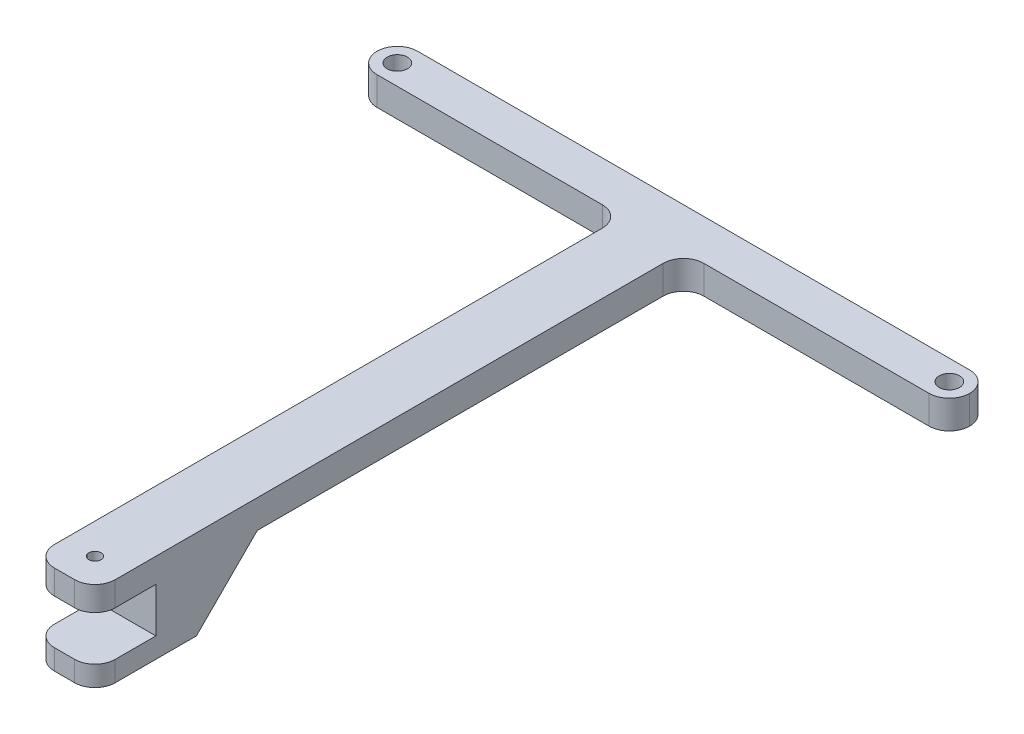
ISO-10303-21;
HEADER;
FILE_DESCRIPTION(('STEP AP214'),'2;1');
FILE_NAME('part.step','',(''),(''),'','','');
FILE_SCHEMA(('AUTOMOTIVE_DESIGN { 1 0 10303 214 1 1 1 1 }'));
ENDSEC;
DATA;
#1=APPLICATION_CONTEXT('core data for automotive mechanical design processes');
#2=APPLICATION_PROTOCOL_DEFINITION('international standard','automotive_design',2000,#1);
#3=PRODUCT_CONTEXT('',#1,'mechanical');
#4=PRODUCT('Part','Part','',(#3));
#5=PRODUCT_RELATED_PRODUCT_CATEGORY('part','',(#4));
#6=PRODUCT_DEFINITION_FORMATION('','',#4);
#7=PRODUCT_DEFINITION_CONTEXT('part definition',#1,'design');
#8=PRODUCT_DEFINITION('design','',#6,#7);
#9=PRODUCT_DEFINITION_SHAPE('','',#8);
#10=(LENGTH_UNIT() NAMED_UNIT(*) SI_UNIT(.MILLI.,.METRE.));
#11=(NAMED_UNIT(*) PLANE_ANGLE_UNIT() SI_UNIT($,.RADIAN.));
#12=(NAMED_UNIT(*) SI_UNIT($,.STERADIAN.) SOLID_ANGLE_UNIT());
#13=UNCERTAINTY_MEASURE_WITH_UNIT(LENGTH_MEASURE(1.E-05),#10,'distance_accuracy_value','');
#14=(GEOMETRIC_REPRESENTATION_CONTEXT(3) GLOBAL_UNCERTAINTY_ASSIGNED_CONTEXT((#13)) GLOBAL_UNIT_ASSIGNED_CONTEXT((#10,
#11,#12)) REPRESENTATION_CONTEXT('',''));
#15=CARTESIAN_POINT('',(0.,0.,0.));
#16=DIRECTION('',(0.,0.,1.));
#17=DIRECTION('',(1.,0.,0.));
#18=AXIS2_PLACEMENT_3D('',#15,#16,#17);
#19=CARTESIAN_POINT('',(7.5,0.,15.));
#20=DIRECTION('',(0.,-1.,0.));
#21=DIRECTION('',(0.,0.,-1.));
#22=AXIS2_PLACEMENT_3D('',#19,#20,#21);
#23=PLANE('',#22);
#24=DIRECTION('',(-1.,0.,0.));
#25=VECTOR('',#24,1.);
#26=CARTESIAN_POINT('',(7.5,0.,15.));
#27=LINE('',#26,#25);
#28=CARTESIAN_POINT('',(2.5,0.,15.));
#29=VERTEX_POINT('',#28);
#30=CARTESIAN_POINT('',(-2.5,0.,15.));
#31=VERTEX_POINT('',#30);
#32=EDGE_CURVE('E292',#29,#31,#27,.T.);
#33=ORIENTED_EDGE('',*,*,#32,.F.);
#34=CARTESIAN_POINT('',(2.5,0.,9.99999999999999));
#35=DIRECTION('',(0.,-1.,0.));
#36=DIRECTION('',(0.,0.,-1.));
#37=AXIS2_PLACEMENT_3D('',#34,#35,#36);
#38=CIRCLE('',#37,5.);
#39=CARTESIAN_POINT('',(7.5,0.,9.99999999999999));
#40=VERTEX_POINT('',#39);
#41=EDGE_CURVE('E382',#29,#40,#38,.F.);
#42=ORIENTED_EDGE('',*,*,#41,.T.);
#43=DIRECTION('',(0.,0.,1.));
#44=VECTOR('',#43,1.);
#45=CARTESIAN_POINT('',(7.5,0.,15.));
#46=LINE('',#45,#44);
#47=CARTESIAN_POINT('',(7.5,0.,0.));
#48=VERTEX_POINT('',#47);
#49=EDGE_CURVE('E206',#48,#40,#46,.T.);
#50=ORIENTED_EDGE('',*,*,#49,.F.);
#51=DIRECTION('',(-1.,0.,0.));
#52=VECTOR('',#51,1.);
#53=CARTESIAN_POINT('',(7.5,0.,0.));
#54=LINE('',#53,#52);
#55=CARTESIAN_POINT('',(-7.5,0.,0.));
#56=VERTEX_POINT('',#55);
#57=EDGE_CURVE('E240',#48,#56,#54,.T.);
#58=ORIENTED_EDGE('',*,*,#57,.T.);
#59=DIRECTION('',(0.,0.,1.));
#60=VECTOR('',#59,1.);
#61=CARTESIAN_POINT('',(-7.5,0.,15.));
#62=LINE('',#61,#60);
#63=CARTESIAN_POINT('',(-7.5,0.,9.99999999999999));
#64=VERTEX_POINT('',#63);
#65=EDGE_CURVE('E241',#56,#64,#62,.T.);
#66=ORIENTED_EDGE('',*,*,#65,.T.);
#67=CARTESIAN_POINT('',(-2.5,0.,9.99999999999999));
#68=DIRECTION('',(0.,-1.,0.));
#69=DIRECTION('',(0.,0.,-1.));
#70=AXIS2_PLACEMENT_3D('',#67,#68,#69);
#71=CIRCLE('',#70,5.);
#72=EDGE_CURVE('E379',#64,#31,#71,.F.);
#73=ORIENTED_EDGE('',*,*,#72,.T.);
#74=EDGE_LOOP('',(#33,#42,#50,#58,#66,#73));
#75=FACE_BOUND('',#74,.T.);
#76=ADVANCED_FACE('F41',(#75),#23,.F.);
#77=CARTESIAN_POINT('',(7.5,-5.,15.));
#78=DIRECTION('',(0.,0.,-1.));
#79=DIRECTION('',(-1.,0.,0.));
#80=AXIS2_PLACEMENT_3D('',#77,#78,#79);
#81=PLANE('',#80);
#82=DIRECTION('',(-1.,0.,0.));
#83=VECTOR('',#82,1.);
#84=CARTESIAN_POINT('',(7.5,-5.,15.));
#85=LINE('',#84,#83);
#86=CARTESIAN_POINT('',(2.5,-5.,15.));
#87=VERTEX_POINT('',#86);
#88=CARTESIAN_POINT('',(-2.5,-5.,15.));
#89=VERTEX_POINT('',#88);
#90=EDGE_CURVE('E216',#87,#89,#85,.T.);
#91=ORIENTED_EDGE('',*,*,#90,.F.);
#92=DIRECTION('',(0.,-1.,0.));
#93=VECTOR('',#92,1.);
#94=CARTESIAN_POINT('',(2.5,0.,15.));
#95=LINE('',#94,#93);
#96=EDGE_CURVE('E376',#87,#29,#95,.F.);
#97=ORIENTED_EDGE('',*,*,#96,.T.);
#98=ORIENTED_EDGE('',*,*,#32,.T.);
#99=DIRECTION('',(0.,-1.,0.));
#100=VECTOR('',#99,1.);
#101=CARTESIAN_POINT('',(-2.5,-5.,15.));
#102=LINE('',#101,#100);
#103=EDGE_CURVE('E372',#31,#89,#102,.T.);
#104=ORIENTED_EDGE('',*,*,#103,.T.);
#105=EDGE_LOOP('',(#91,#97,#98,#104));
#106=FACE_BOUND('',#105,.T.);
#107=ADVANCED_FACE('F476',(#106),#81,.F.);
#108=CARTESIAN_POINT('',(7.5,-5.,15.));
#109=DIRECTION('',(0.,1.,0.));
#110=DIRECTION('',(0.,0.,1.));
#111=AXIS2_PLACEMENT_3D('',#108,#109,#110);
#112=PLANE('',#111);
#113=DIRECTION('',(0.,0.,-1.));
#114=VECTOR('',#113,1.);
#115=CARTESIAN_POINT('',(7.5,-5.,15.));
#116=LINE('',#115,#114);
#117=CARTESIAN_POINT('',(7.5,-5.,9.99999999999999));
#118=VERTEX_POINT('',#117);
#119=CARTESIAN_POINT('',(7.5,-5.,-10.));
#120=VERTEX_POINT('',#119);
#121=EDGE_CURVE('E194',#118,#120,#116,.T.);
#122=ORIENTED_EDGE('',*,*,#121,.F.);
#123=CARTESIAN_POINT('',(2.5,-5.,9.99999999999999));
#124=DIRECTION('',(0.,1.,0.));
#125=DIRECTION('',(0.,0.,1.));
#126=AXIS2_PLACEMENT_3D('',#123,#124,#125);
#127=CIRCLE('',#126,5.);
#128=EDGE_CURVE('E369',#118,#87,#127,.F.);
#129=ORIENTED_EDGE('',*,*,#128,.T.);
#130=ORIENTED_EDGE('',*,*,#90,.T.);
#131=CARTESIAN_POINT('',(-2.5,-5.,9.99999999999999));
#132=DIRECTION('',(0.,1.,0.));
#133=DIRECTION('',(0.,0.,1.));
#134=AXIS2_PLACEMENT_3D('',#131,#132,#133);
#135=CIRCLE('',#134,5.);
#136=CARTESIAN_POINT('',(-7.5,-5.,9.99999999999999));
#137=VERTEX_POINT('',#136);
#138=EDGE_CURVE('E366',#89,#137,#135,.F.);
#139=ORIENTED_EDGE('',*,*,#138,.T.);
#140=DIRECTION('',(0.,0.,-1.));
#141=VECTOR('',#140,1.);
#142=CARTESIAN_POINT('',(-7.5,-5.,15.));
#143=LINE('',#142,#141);
#144=CARTESIAN_POINT('',(-7.5,-5.,-10.));
#145=VERTEX_POINT('',#144);
#146=EDGE_CURVE('E212',#137,#145,#143,.T.);
#147=ORIENTED_EDGE('',*,*,#146,.T.);
#148=DIRECTION('',(-1.,0.,0.));
#149=VECTOR('',#148,1.);
#150=CARTESIAN_POINT('',(7.5,-5.,-10.));
#151=LINE('',#150,#149);
#152=EDGE_CURVE('E209',#120,#145,#151,.T.);
#153=ORIENTED_EDGE('',*,*,#152,.F.);
#154=EDGE_LOOP('',(#122,#129,#130,#139,#147,#153));
#155=FACE_BOUND('',#154,.T.);
#156=ADVANCED_FACE('F210',(#155),#112,.F.);
#157=CARTESIAN_POINT('',(7.5,-5.,-10.));
#158=DIRECTION('',(0.,0.707106781186546,0.707106781186549));
#159=DIRECTION('',(0.,-0.707106781186549,0.707106781186546));
#160=AXIS2_PLACEMENT_3D('',#157,#158,#159);
#161=PLANE('',#160);
#162=DIRECTION('',(0.,0.707106781186549,-0.707106781186546));
#163=VECTOR('',#162,1.);
#164=CARTESIAN_POINT('',(-7.5,-5.,-10.));
#165=LINE('',#164,#163);
#166=CARTESIAN_POINT('',(-7.5,10.,-25.));
#167=VERTEX_POINT('',#166);
#168=EDGE_CURVE('E248',#145,#167,#165,.T.);
#169=ORIENTED_EDGE('',*,*,#168,.T.);
#170=DIRECTION('',(-1.,0.,0.));
#171=VECTOR('',#170,1.);
#172=CARTESIAN_POINT('',(7.5,10.,-25.));
#173=LINE('',#172,#171);
#174=CARTESIAN_POINT('',(7.5,10.,-25.));
#175=VERTEX_POINT('',#174);
#176=EDGE_CURVE('E217',#175,#167,#173,.T.);
#177=ORIENTED_EDGE('',*,*,#176,.F.);
#178=DIRECTION('',(0.,0.707106781186549,-0.707106781186546));
#179=VECTOR('',#178,1.);
#180=CARTESIAN_POINT('',(7.5,-5.,-10.));
#181=LINE('',#180,#179);
#182=EDGE_CURVE('E199',#120,#175,#181,.T.);
#183=ORIENTED_EDGE('',*,*,#182,.F.);
#184=ORIENTED_EDGE('',*,*,#152,.T.);
#185=EDGE_LOOP('',(#169,#177,#183,#184));
#186=FACE_BOUND('',#185,.T.);
#187=ADVANCED_FACE('F219',(#186),#161,.F.);
#188=CARTESIAN_POINT('',(7.5,10.,-25.));
#189=DIRECTION('',(0.,1.,0.));
#190=DIRECTION('',(0.,0.,1.));
#191=AXIS2_PLACEMENT_3D('',#188,#189,#190);
#192=PLANE('',#191);
#193=CARTESIAN_POINT('',(-68.,10.,-135.));
#194=DIRECTION('',(0.,1.,0.));
#195=DIRECTION('',(0.,0.,1.));
#196=AXIS2_PLACEMENT_3D('',#193,#194,#195);
#197=CIRCLE('',#196,5.);
#198=CARTESIAN_POINT('',(-68.,10.,-130.));
#199=VERTEX_POINT('',#198);
#200=CARTESIAN_POINT('',(-73.,10.,-135.));
#201=VERTEX_POINT('',#200);
#202=EDGE_CURVE('E344',#199,#201,#197,.F.);
#203=ORIENTED_EDGE('',*,*,#202,.T.);
#204=CARTESIAN_POINT('',(-68.,10.,-135.));
#205=DIRECTION('',(0.,1.,0.));
#206=DIRECTION('',(0.,0.,1.));
#207=AXIS2_PLACEMENT_3D('',#204,#205,#206);
#208=CIRCLE('',#207,5.);
#209=CARTESIAN_POINT('',(-68.,10.,-140.));
#210=VERTEX_POINT('',#209);
#211=EDGE_CURVE('E347',#201,#210,#208,.F.);
#212=ORIENTED_EDGE('',*,*,#211,.T.);
#213=DIRECTION('',(-1.,0.,0.));
#214=VECTOR('',#213,1.);
#215=CARTESIAN_POINT('',(7.5,10.,-140.));
#216=LINE('',#215,#214);
#217=CARTESIAN_POINT('',(68.,10.,-140.));
#218=VERTEX_POINT('',#217);
#219=EDGE_CURVE('E283',#218,#210,#216,.T.);
#220=ORIENTED_EDGE('',*,*,#219,.F.);
#221=CARTESIAN_POINT('',(68.,10.,-135.));
#222=DIRECTION('',(0.,1.,0.));
#223=DIRECTION('',(0.,0.,1.));
#224=AXIS2_PLACEMENT_3D('',#221,#222,#223);
#225=CIRCLE('',#224,5.);
#226=CARTESIAN_POINT('',(73.,10.,-135.));
#227=VERTEX_POINT('',#226);
#228=EDGE_CURVE('E341',#218,#227,#225,.F.);
#229=ORIENTED_EDGE('',*,*,#228,.T.);
#230=CARTESIAN_POINT('',(68.,10.,-135.));
#231=DIRECTION('',(0.,1.,0.));
#232=DIRECTION('',(0.,0.,1.));
#233=AXIS2_PLACEMENT_3D('',#230,#231,#232);
#234=CIRCLE('',#233,5.);
#235=CARTESIAN_POINT('',(68.,10.,-130.));
#236=VERTEX_POINT('',#235);
#237=EDGE_CURVE('E338',#227,#236,#234,.F.);
#238=ORIENTED_EDGE('',*,*,#237,.T.);
#239=DIRECTION('',(-1.,0.,0.));
#240=VECTOR('',#239,1.);
#241=CARTESIAN_POINT('',(-73.,10.,-130.));
#242=LINE('',#241,#240);
#243=CARTESIAN_POINT('',(12.5,10.,-130.));
#244=VERTEX_POINT('',#243);
#245=EDGE_CURVE('E431',#236,#244,#242,.T.);
#246=ORIENTED_EDGE('',*,*,#245,.T.);
#247=CARTESIAN_POINT('',(12.5,10.,-125.));
#248=DIRECTION('',(0.,1.,0.));
#249=DIRECTION('',(0.,0.,1.));
#250=AXIS2_PLACEMENT_3D('',#247,#248,#249);
#251=CIRCLE('',#250,5.);
#252=CARTESIAN_POINT('',(7.5,10.,-125.));
#253=VERTEX_POINT('',#252);
#254=EDGE_CURVE('E51',#244,#253,#251,.T.);
#255=ORIENTED_EDGE('',*,*,#254,.T.);
#256=DIRECTION('',(0.,0.,-1.));
#257=VECTOR('',#256,1.);
#258=CARTESIAN_POINT('',(7.5,10.,-25.));
#259=LINE('',#258,#257);
#260=EDGE_CURVE('E223',#175,#253,#259,.T.);
#261=ORIENTED_EDGE('',*,*,#260,.F.);
#262=ORIENTED_EDGE('',*,*,#176,.T.);
#263=DIRECTION('',(0.,0.,-1.));
#264=VECTOR('',#263,1.);
#265=CARTESIAN_POINT('',(-7.5,10.,-25.));
#266=LINE('',#265,#264);
#267=CARTESIAN_POINT('',(-7.5,10.,-125.));
#268=VERTEX_POINT('',#267);
#269=EDGE_CURVE('E251',#167,#268,#266,.T.);
#270=ORIENTED_EDGE('',*,*,#269,.T.);
#271=CARTESIAN_POINT('',(-12.5,10.,-125.));
#272=DIRECTION('',(0.,1.,0.));
#273=DIRECTION('',(0.,0.,1.));
#274=AXIS2_PLACEMENT_3D('',#271,#272,#273);
#275=CIRCLE('',#274,5.);
#276=CARTESIAN_POINT('',(-12.5,10.,-130.));
#277=VERTEX_POINT('',#276);
#278=EDGE_CURVE('E395',#268,#277,#275,.T.);
#279=ORIENTED_EDGE('',*,*,#278,.T.);
#280=EDGE_CURVE('E440',#277,#199,#242,.T.);
#281=ORIENTED_EDGE('',*,*,#280,.T.);
#282=EDGE_LOOP('',(#203,#212,#220,#229,#238,#246,#255,#261,#262,#270,#279,#281));
#283=FACE_BOUND('',#282,.T.);
#284=CARTESIAN_POINT('',(-68.,10.,-135.));
#285=DIRECTION('',(0.,1.,0.));
#286=DIRECTION('',(0.,0.,1.));
#287=AXIS2_PLACEMENT_3D('',#284,#285,#286);
#288=CIRCLE('',#287,2.5);
#289=CARTESIAN_POINT('',(-68.,10.,-132.5));
#290=VERTEX_POINT('',#289);
#291=EDGE_CURVE('E446',#290,#290,#288,.F.);
#292=ORIENTED_EDGE('',*,*,#291,.F.);
#293=EDGE_LOOP('',(#292));
#294=FACE_BOUND('',#293,.T.);
#295=CARTESIAN_POINT('',(68.,10.,-135.));
#296=DIRECTION('',(0.,1.,0.));
#297=DIRECTION('',(0.,0.,1.));
#298=AXIS2_PLACEMENT_3D('',#295,#296,#297);
#299=CIRCLE('',#298,2.50000000000001);
#300=CARTESIAN_POINT('',(68.,10.,-132.5));
#301=VERTEX_POINT('',#300);
#302=EDGE_CURVE('E439',#301,#301,#299,.F.);
#303=ORIENTED_EDGE('',*,*,#302,.F.);
#304=EDGE_LOOP('',(#303));
#305=FACE_BOUND('',#304,.T.);
#306=ADVANCED_FACE('F429',(#283,#294,#305),#192,.F.);
#307=CARTESIAN_POINT('',(7.5,17.,-140.));
#308=DIRECTION('',(0.,0.,1.));
#309=DIRECTION('',(1.,0.,0.));
#310=AXIS2_PLACEMENT_3D('',#307,#308,#309);
#311=PLANE('',#310);
#312=ORIENTED_EDGE('',*,*,#219,.T.);
#313=DIRECTION('',(0.,1.,0.));
#314=VECTOR('',#313,1.);
#315=CARTESIAN_POINT('',(-68.,17.,-140.));
#316=LINE('',#315,#314);
#317=CARTESIAN_POINT('',(-68.,17.,-140.));
#318=VERTEX_POINT('',#317);
#319=EDGE_CURVE('E316',#210,#318,#316,.T.);
#320=ORIENTED_EDGE('',*,*,#319,.T.);
#321=DIRECTION('',(-1.,0.,0.));
#322=VECTOR('',#321,1.);
#323=CARTESIAN_POINT('',(7.5,17.,-140.));
#324=LINE('',#323,#322);
#325=CARTESIAN_POINT('',(68.,17.,-140.));
#326=VERTEX_POINT('',#325);
#327=EDGE_CURVE('E279',#326,#318,#324,.T.);
#328=ORIENTED_EDGE('',*,*,#327,.F.);
#329=DIRECTION('',(0.,1.,0.));
#330=VECTOR('',#329,1.);
#331=CARTESIAN_POINT('',(68.,10.,-140.));
#332=LINE('',#331,#330);
#333=EDGE_CURVE('E312',#326,#218,#332,.F.);
#334=ORIENTED_EDGE('',*,*,#333,.T.);
#335=EDGE_LOOP('',(#312,#320,#328,#334));
#336=FACE_BOUND('',#335,.T.);
#337=ADVANCED_FACE('F646',(#336),#311,.F.);
#338=CARTESIAN_POINT('',(7.5,17.,15.));
#339=DIRECTION('',(0.,-1.,0.));
#340=DIRECTION('',(0.,0.,-1.));
#341=AXIS2_PLACEMENT_3D('',#338,#339,#340);
#342=PLANE('',#341);
#343=CARTESIAN_POINT('',(0.,17.,7.5));
#344=DIRECTION('',(0.,1.,0.));
#345=DIRECTION('',(0.,0.,1.));
#346=AXIS2_PLACEMENT_3D('',#343,#344,#345);
#347=CIRCLE('',#346,1.5);
#348=CARTESIAN_POINT('',(0.,17.,9.));
#349=VERTEX_POINT('',#348);
#350=EDGE_CURVE('E458',#349,#349,#347,.T.);
#351=ORIENTED_EDGE('',*,*,#350,.F.);
#352=EDGE_LOOP('',(#351));
#353=FACE_BOUND('',#352,.T.);
#354=ORIENTED_EDGE('',*,*,#327,.T.);
#355=CARTESIAN_POINT('',(-68.,17.,-135.));
#356=DIRECTION('',(0.,-1.,0.));
#357=DIRECTION('',(0.,0.,-1.));
#358=AXIS2_PLACEMENT_3D('',#355,#356,#357);
#359=CIRCLE('',#358,5.);
#360=CARTESIAN_POINT('',(-73.,17.,-135.));
#361=VERTEX_POINT('',#360);
#362=EDGE_CURVE('E335',#318,#361,#359,.F.);
#363=ORIENTED_EDGE('',*,*,#362,.T.);
#364=CARTESIAN_POINT('',(-68.,17.,-135.));
#365=DIRECTION('',(0.,-1.,0.));
#366=DIRECTION('',(0.,0.,-1.));
#367=AXIS2_PLACEMENT_3D('',#364,#365,#366);
#368=CIRCLE('',#367,5.);
#369=CARTESIAN_POINT('',(-68.,17.,-130.));
#370=VERTEX_POINT('',#369);
#371=EDGE_CURVE('E332',#361,#370,#368,.F.);
#372=ORIENTED_EDGE('',*,*,#371,.T.);
#373=DIRECTION('',(1.,0.,0.));
#374=VECTOR('',#373,1.);
#375=CARTESIAN_POINT('',(-73.,17.,-130.));
#376=LINE('',#375,#374);
#377=CARTESIAN_POINT('',(-12.5,17.,-130.));
#378=VERTEX_POINT('',#377);
#379=EDGE_CURVE('E449',#370,#378,#376,.T.);
#380=ORIENTED_EDGE('',*,*,#379,.T.);
#381=CARTESIAN_POINT('',(-12.5,17.,-125.));
#382=DIRECTION('',(0.,-1.,0.));
#383=DIRECTION('',(0.,0.,-1.));
#384=AXIS2_PLACEMENT_3D('',#381,#382,#383);
#385=CIRCLE('',#384,5.);
#386=CARTESIAN_POINT('',(-7.5,17.,-125.));
#387=VERTEX_POINT('',#386);
#388=EDGE_CURVE('E398',#378,#387,#385,.T.);
#389=ORIENTED_EDGE('',*,*,#388,.T.);
#390=DIRECTION('',(0.,0.,1.));
#391=VECTOR('',#390,1.);
#392=CARTESIAN_POINT('',(-7.5,17.,15.));
#393=LINE('',#392,#391);
#394=CARTESIAN_POINT('',(-7.5,17.,10.));
#395=VERTEX_POINT('',#394);
#396=EDGE_CURVE('E255',#387,#395,#393,.T.);
#397=ORIENTED_EDGE('',*,*,#396,.T.);
#398=CARTESIAN_POINT('',(-2.5,17.,10.));
#399=DIRECTION('',(0.,-1.,0.));
#400=DIRECTION('',(0.,0.,-1.));
#401=AXIS2_PLACEMENT_3D('',#398,#399,#400);
#402=CIRCLE('',#401,5.);
#403=CARTESIAN_POINT('',(-2.5,17.,15.));
#404=VERTEX_POINT('',#403);
#405=EDGE_CURVE('E329',#395,#404,#402,.F.);
#406=ORIENTED_EDGE('',*,*,#405,.T.);
#407=DIRECTION('',(-1.,0.,0.));
#408=VECTOR('',#407,1.);
#409=CARTESIAN_POINT('',(7.5,17.,15.));
#410=LINE('',#409,#408);
#411=CARTESIAN_POINT('',(2.5,17.,15.));
#412=VERTEX_POINT('',#411);
#413=EDGE_CURVE('E275',#412,#404,#410,.T.);
#414=ORIENTED_EDGE('',*,*,#413,.F.);
#415=CARTESIAN_POINT('',(2.5,17.,10.));
#416=DIRECTION('',(0.,-1.,0.));
#417=DIRECTION('',(0.,0.,-1.));
#418=AXIS2_PLACEMENT_3D('',#415,#416,#417);
#419=CIRCLE('',#418,5.);
#420=CARTESIAN_POINT('',(7.5,17.,10.));
#421=VERTEX_POINT('',#420);
#422=EDGE_CURVE('E326',#412,#421,#419,.F.);
#423=ORIENTED_EDGE('',*,*,#422,.T.);
#424=DIRECTION('',(0.,0.,1.));
#425=VECTOR('',#424,1.);
#426=CARTESIAN_POINT('',(7.5,17.,15.));
#427=LINE('',#426,#425);
#428=CARTESIAN_POINT('',(7.5,17.,-125.));
#429=VERTEX_POINT('',#428);
#430=EDGE_CURVE('E227',#429,#421,#427,.T.);
#431=ORIENTED_EDGE('',*,*,#430,.F.);
#432=CARTESIAN_POINT('',(12.5,17.,-125.));
#433=DIRECTION('',(0.,-1.,0.));
#434=DIRECTION('',(0.,0.,-1.));
#435=AXIS2_PLACEMENT_3D('',#432,#433,#434);
#436=CIRCLE('',#435,5.);
#437=CARTESIAN_POINT('',(12.5,17.,-130.));
#438=VERTEX_POINT('',#437);
#439=EDGE_CURVE('E11',#429,#438,#436,.T.);
#440=ORIENTED_EDGE('',*,*,#439,.T.);
#441=CARTESIAN_POINT('',(68.,17.,-130.));
#442=VERTEX_POINT('',#441);
#443=EDGE_CURVE('E455',#438,#442,#376,.T.);
#444=ORIENTED_EDGE('',*,*,#443,.T.);
#445=CARTESIAN_POINT('',(68.,17.,-135.));
#446=DIRECTION('',(0.,-1.,0.));
#447=DIRECTION('',(0.,0.,-1.));
#448=AXIS2_PLACEMENT_3D('',#445,#446,#447);
#449=CIRCLE('',#448,5.);
#450=CARTESIAN_POINT('',(73.,17.,-135.));
#451=VERTEX_POINT('',#450);
#452=EDGE_CURVE('E320',#442,#451,#449,.F.);
#453=ORIENTED_EDGE('',*,*,#452,.T.);
#454=CARTESIAN_POINT('',(68.,17.,-135.));
#455=DIRECTION('',(0.,-1.,0.));
#456=DIRECTION('',(0.,0.,-1.));
#457=AXIS2_PLACEMENT_3D('',#454,#455,#456);
#458=CIRCLE('',#457,5.);
#459=EDGE_CURVE('E323',#451,#326,#458,.F.);
#460=ORIENTED_EDGE('',*,*,#459,.T.);
#461=EDGE_LOOP('',(#354,#363,#372,#380,#389,#397,#406,#414,#423,#431,#440,#444,#453,#460));
#462=FACE_BOUND('',#461,.T.);
#463=CARTESIAN_POINT('',(-68.,17.,-135.));
#464=DIRECTION('',(0.,1.,0.));
#465=DIRECTION('',(0.,0.,1.));
#466=AXIS2_PLACEMENT_3D('',#463,#464,#465);
#467=CIRCLE('',#466,2.5);
#468=CARTESIAN_POINT('',(-68.,17.,-132.5));
#469=VERTEX_POINT('',#468);
#470=EDGE_CURVE('E413',#469,#469,#467,.T.);
#471=ORIENTED_EDGE('',*,*,#470,.F.);
#472=EDGE_LOOP('',(#471));
#473=FACE_BOUND('',#472,.T.);
#474=CARTESIAN_POINT('',(68.,17.,-135.));
#475=DIRECTION('',(0.,1.,0.));
#476=DIRECTION('',(0.,0.,1.));
#477=AXIS2_PLACEMENT_3D('',#474,#475,#476);
#478=CIRCLE('',#477,2.50000000000001);
#479=CARTESIAN_POINT('',(68.,17.,-132.5));
#480=VERTEX_POINT('',#479);
#481=EDGE_CURVE('E405',#480,#480,#478,.T.);
#482=ORIENTED_EDGE('',*,*,#481,.F.);
#483=EDGE_LOOP('',(#482));
#484=FACE_BOUND('',#483,.T.);
#485=ADVANCED_FACE('F494',(#353,#462,#473,#484),#342,.F.);
#486=CARTESIAN_POINT('',(7.5,11.,15.));
#487=DIRECTION('',(0.,0.,-1.));
#488=DIRECTION('',(-1.,0.,0.));
#489=AXIS2_PLACEMENT_3D('',#486,#487,#488);
#490=PLANE('',#489);
#491=ORIENTED_EDGE('',*,*,#413,.T.);
#492=DIRECTION('',(0.,-1.,0.));
#493=VECTOR('',#492,1.);
#494=CARTESIAN_POINT('',(-2.5,11.,15.));
#495=LINE('',#494,#493);
#496=CARTESIAN_POINT('',(-2.5,11.,15.));
#497=VERTEX_POINT('',#496);
#498=EDGE_CURVE('E388',#404,#497,#495,.T.);
#499=ORIENTED_EDGE('',*,*,#498,.T.);
#500=DIRECTION('',(-1.,0.,0.));
#501=VECTOR('',#500,1.);
#502=CARTESIAN_POINT('',(7.5,11.,15.));
#503=LINE('',#502,#501);
#504=CARTESIAN_POINT('',(2.5,11.,15.));
#505=VERTEX_POINT('',#504);
#506=EDGE_CURVE('E272',#505,#497,#503,.T.);
#507=ORIENTED_EDGE('',*,*,#506,.F.);
#508=DIRECTION('',(0.,-1.,0.));
#509=VECTOR('',#508,1.);
#510=CARTESIAN_POINT('',(2.5,17.,15.));
#511=LINE('',#510,#509);
#512=EDGE_CURVE('E385',#505,#412,#511,.F.);
#513=ORIENTED_EDGE('',*,*,#512,.T.);
#514=EDGE_LOOP('',(#491,#499,#507,#513));
#515=FACE_BOUND('',#514,.T.);
#516=ADVANCED_FACE('F503',(#515),#490,.F.);
#517=CARTESIAN_POINT('',(7.5,11.,0.));
#518=DIRECTION('',(0.,1.,0.));
#519=DIRECTION('',(0.,0.,1.));
#520=AXIS2_PLACEMENT_3D('',#517,#518,#519);
#521=PLANE('',#520);
#522=CARTESIAN_POINT('',(0.,11.,7.5));
#523=DIRECTION('',(0.,1.,0.));
#524=DIRECTION('',(0.,0.,1.));
#525=AXIS2_PLACEMENT_3D('',#522,#523,#524);
#526=CIRCLE('',#525,1.5);
#527=CARTESIAN_POINT('',(0.,11.,9.));
#528=VERTEX_POINT('',#527);
#529=EDGE_CURVE('E245',#528,#528,#526,.F.);
#530=ORIENTED_EDGE('',*,*,#529,.F.);
#531=EDGE_LOOP('',(#530));
#532=FACE_BOUND('',#531,.T.);
#533=ORIENTED_EDGE('',*,*,#506,.T.);
#534=CARTESIAN_POINT('',(-2.5,11.,10.));
#535=DIRECTION('',(0.,1.,0.));
#536=DIRECTION('',(0.,0.,1.));
#537=AXIS2_PLACEMENT_3D('',#534,#535,#536);
#538=CIRCLE('',#537,5.);
#539=CARTESIAN_POINT('',(-7.5,11.,10.));
#540=VERTEX_POINT('',#539);
#541=EDGE_CURVE('E59',#497,#540,#538,.F.);
#542=ORIENTED_EDGE('',*,*,#541,.T.);
#543=DIRECTION('',(0.,0.,-1.));
#544=VECTOR('',#543,1.);
#545=CARTESIAN_POINT('',(-7.5,11.,0.));
#546=LINE('',#545,#544);
#547=CARTESIAN_POINT('',(-7.5,11.,0.));
#548=VERTEX_POINT('',#547);
#549=EDGE_CURVE('E259',#540,#548,#546,.T.);
#550=ORIENTED_EDGE('',*,*,#549,.T.);
#551=DIRECTION('',(-1.,0.,0.));
#552=VECTOR('',#551,1.);
#553=CARTESIAN_POINT('',(7.5,11.,0.));
#554=LINE('',#553,#552);
#555=CARTESIAN_POINT('',(7.5,11.,0.));
#556=VERTEX_POINT('',#555);
#557=EDGE_CURVE('E268',#556,#548,#554,.T.);
#558=ORIENTED_EDGE('',*,*,#557,.F.);
#559=DIRECTION('',(0.,0.,-1.));
#560=VECTOR('',#559,1.);
#561=CARTESIAN_POINT('',(7.5,11.,0.));
#562=LINE('',#561,#560);
#563=CARTESIAN_POINT('',(7.5,11.,10.));
#564=VERTEX_POINT('',#563);
#565=EDGE_CURVE('E234',#564,#556,#562,.T.);
#566=ORIENTED_EDGE('',*,*,#565,.F.);
#567=CARTESIAN_POINT('',(2.5,11.,10.));
#568=DIRECTION('',(0.,1.,0.));
#569=DIRECTION('',(0.,0.,1.));
#570=AXIS2_PLACEMENT_3D('',#567,#568,#569);
#571=CIRCLE('',#570,5.);
#572=EDGE_CURVE('E67',#564,#505,#571,.F.);
#573=ORIENTED_EDGE('',*,*,#572,.T.);
#574=EDGE_LOOP('',(#533,#542,#550,#558,#566,#573));
#575=FACE_BOUND('',#574,.T.);
#576=ADVANCED_FACE('F506',(#532,#575),#521,.F.);
#577=CARTESIAN_POINT('',(7.5,0.,0.));
#578=DIRECTION('',(0.,0.,-1.));
#579=DIRECTION('',(-1.,0.,0.));
#580=AXIS2_PLACEMENT_3D('',#577,#578,#579);
#581=PLANE('',#580);
#582=DIRECTION('',(0.,-1.,0.));
#583=VECTOR('',#582,1.);
#584=CARTESIAN_POINT('',(-7.5,0.,0.));
#585=LINE('',#584,#583);
#586=EDGE_CURVE('E262',#548,#56,#585,.T.);
#587=ORIENTED_EDGE('',*,*,#586,.T.);
#588=ORIENTED_EDGE('',*,*,#57,.F.);
#589=DIRECTION('',(0.,-1.,0.));
#590=VECTOR('',#589,1.);
#591=CARTESIAN_POINT('',(7.5,0.,0.));
#592=LINE('',#591,#590);
#593=EDGE_CURVE('E237',#556,#48,#592,.T.);
#594=ORIENTED_EDGE('',*,*,#593,.F.);
#595=ORIENTED_EDGE('',*,*,#557,.T.);
#596=EDGE_LOOP('',(#587,#588,#594,#595));
#597=FACE_BOUND('',#596,.T.);
#598=ADVANCED_FACE('F511',(#597),#581,.F.);
#599=CARTESIAN_POINT('',(7.5,0.,0.));
#600=DIRECTION('',(1.,0.,0.));
#601=DIRECTION('',(0.,0.,-1.));
#602=AXIS2_PLACEMENT_3D('',#599,#600,#601);
#603=PLANE('',#602);
#604=ORIENTED_EDGE('',*,*,#260,.T.);
#605=DIRECTION('',(0.,-1.,0.));
#606=VECTOR('',#605,1.);
#607=CARTESIAN_POINT('',(7.5,17.,-125.));
#608=LINE('',#607,#606);
#609=EDGE_CURVE('E363',#253,#429,#608,.F.);
#610=ORIENTED_EDGE('',*,*,#609,.T.);
#611=ORIENTED_EDGE('',*,*,#430,.T.);
#612=DIRECTION('',(0.,-1.,0.));
#613=VECTOR('',#612,1.);
#614=CARTESIAN_POINT('',(7.5,11.,10.));
#615=LINE('',#614,#613);
#616=EDGE_CURVE('E357',#421,#564,#615,.T.);
#617=ORIENTED_EDGE('',*,*,#616,.T.);
#618=ORIENTED_EDGE('',*,*,#565,.T.);
#619=ORIENTED_EDGE('',*,*,#593,.T.);
#620=ORIENTED_EDGE('',*,*,#49,.T.);
#621=DIRECTION('',(0.,-1.,0.));
#622=VECTOR('',#621,1.);
#623=CARTESIAN_POINT('',(7.5,-5.,9.99999999999999));
#624=LINE('',#623,#622);
#625=EDGE_CURVE('E203',#40,#118,#624,.T.);
#626=ORIENTED_EDGE('',*,*,#625,.T.);
#627=ORIENTED_EDGE('',*,*,#121,.T.);
#628=ORIENTED_EDGE('',*,*,#182,.T.);
#629=EDGE_LOOP('',(#604,#610,#611,#617,#618,#619,#620,#626,#627,#628));
#630=FACE_BOUND('',#629,.T.);
#631=ADVANCED_FACE('F197',(#630),#603,.T.);
#632=CARTESIAN_POINT('',(-7.5,0.,0.));
#633=DIRECTION('',(1.,0.,0.));
#634=DIRECTION('',(0.,0.,-1.));
#635=AXIS2_PLACEMENT_3D('',#632,#633,#634);
#636=PLANE('',#635);
#637=ORIENTED_EDGE('',*,*,#396,.F.);
#638=DIRECTION('',(0.,-1.,0.));
#639=VECTOR('',#638,1.);
#640=CARTESIAN_POINT('',(-7.5,0.,-125.));
#641=LINE('',#640,#639);
#642=EDGE_CURVE('E302',#387,#268,#641,.T.);
#643=ORIENTED_EDGE('',*,*,#642,.T.);
#644=ORIENTED_EDGE('',*,*,#269,.F.);
#645=ORIENTED_EDGE('',*,*,#168,.F.);
#646=ORIENTED_EDGE('',*,*,#146,.F.);
#647=DIRECTION('',(0.,-1.,0.));
#648=VECTOR('',#647,1.);
#649=CARTESIAN_POINT('',(-7.5,0.,9.99999999999999));
#650=LINE('',#649,#648);
#651=EDGE_CURVE('E299',#137,#64,#650,.F.);
#652=ORIENTED_EDGE('',*,*,#651,.T.);
#653=ORIENTED_EDGE('',*,*,#65,.F.);
#654=ORIENTED_EDGE('',*,*,#586,.F.);
#655=ORIENTED_EDGE('',*,*,#549,.F.);
#656=DIRECTION('',(0.,-1.,0.));
#657=VECTOR('',#656,1.);
#658=CARTESIAN_POINT('',(-7.5,0.,10.));
#659=LINE('',#658,#657);
#660=EDGE_CURVE('E296',#540,#395,#659,.F.);
#661=ORIENTED_EDGE('',*,*,#660,.T.);
#662=EDGE_LOOP('',(#637,#643,#644,#645,#646,#652,#653,#654,#655,#661));
#663=FACE_BOUND('',#662,.T.);
#664=ADVANCED_FACE('F485',(#663),#636,.F.);
#665=CARTESIAN_POINT('',(0.,6.75735931288071,7.5));
#666=DIRECTION('',(0.,1.,0.));
#667=DIRECTION('',(0.,0.,1.));
#668=AXIS2_PLACEMENT_3D('',#665,#666,#667);
#669=CYLINDRICAL_SURFACE('',#668,1.5);
#670=CARTESIAN_POINT('',(0.,11.,9.));
#671=CARTESIAN_POINT('',(0.,11.0625,9.));
#672=CARTESIAN_POINT('',(0.,11.125,9.));
#673=CARTESIAN_POINT('',(0.,11.25,9.));
#674=CARTESIAN_POINT('',(0.,11.3125,9.));
#675=CARTESIAN_POINT('',(0.,11.4375,9.));
#676=CARTESIAN_POINT('',(0.,11.5,9.));
#677=CARTESIAN_POINT('',(0.,11.625,9.));
#678=CARTESIAN_POINT('',(0.,11.6875,9.));
#679=CARTESIAN_POINT('',(0.,11.8125,9.));
#680=CARTESIAN_POINT('',(0.,11.875,9.));
#681=CARTESIAN_POINT('',(0.,12.,9.));
#682=CARTESIAN_POINT('',(0.,12.0625,9.));
#683=CARTESIAN_POINT('',(0.,12.1875,9.));
#684=CARTESIAN_POINT('',(0.,12.25,9.));
#685=CARTESIAN_POINT('',(0.,12.375,9.));
#686=CARTESIAN_POINT('',(0.,12.4375,9.));
#687=CARTESIAN_POINT('',(0.,12.5625,9.));
#688=CARTESIAN_POINT('',(0.,12.625,9.));
#689=CARTESIAN_POINT('',(0.,12.75,9.));
#690=CARTESIAN_POINT('',(0.,12.8125,9.));
#691=CARTESIAN_POINT('',(0.,12.9375,9.));
#692=CARTESIAN_POINT('',(0.,13.,9.));
#693=CARTESIAN_POINT('',(0.,13.125,9.));
#694=CARTESIAN_POINT('',(0.,13.1875,9.));
#695=CARTESIAN_POINT('',(0.,13.3125,9.));
#696=CARTESIAN_POINT('',(0.,13.375,9.));
#697=CARTESIAN_POINT('',(0.,13.5,9.));
#698=CARTESIAN_POINT('',(0.,13.5625,9.));
#699=CARTESIAN_POINT('',(0.,13.6875,9.));
#700=CARTESIAN_POINT('',(0.,13.75,9.));
#701=CARTESIAN_POINT('',(0.,13.875,9.));
#702=CARTESIAN_POINT('',(0.,13.9375,9.));
#703=CARTESIAN_POINT('',(0.,14.0625,9.));
#704=CARTESIAN_POINT('',(0.,14.125,9.));
#705=CARTESIAN_POINT('',(0.,14.25,9.));
#706=CARTESIAN_POINT('',(0.,14.3125,9.));
#707=CARTESIAN_POINT('',(0.,14.4375,9.));
#708=CARTESIAN_POINT('',(0.,14.5,9.));
#709=CARTESIAN_POINT('',(0.,14.625,9.));
#710=CARTESIAN_POINT('',(0.,14.6875,9.));
#711=CARTESIAN_POINT('',(0.,14.8125,9.));
#712=CARTESIAN_POINT('',(0.,14.875,9.));
#713=CARTESIAN_POINT('',(0.,15.,9.));
#714=CARTESIAN_POINT('',(0.,15.0625,9.));
#715=CARTESIAN_POINT('',(0.,15.1875,9.));
#716=CARTESIAN_POINT('',(0.,15.25,9.));
#717=CARTESIAN_POINT('',(0.,15.375,9.));
#718=CARTESIAN_POINT('',(0.,15.4375,9.));
#719=CARTESIAN_POINT('',(0.,15.5625,9.));
#720=CARTESIAN_POINT('',(0.,15.625,9.));
#721=CARTESIAN_POINT('',(0.,15.75,9.));
#722=CARTESIAN_POINT('',(0.,15.8125,9.));
#723=CARTESIAN_POINT('',(0.,15.9375,9.));
#724=CARTESIAN_POINT('',(0.,16.,9.));
#725=CARTESIAN_POINT('',(0.,16.125,9.));
#726=CARTESIAN_POINT('',(0.,16.1875,9.));
#727=CARTESIAN_POINT('',(0.,16.3125,9.));
#728=CARTESIAN_POINT('',(0.,16.375,9.));
#729=CARTESIAN_POINT('',(0.,16.5,9.));
#730=CARTESIAN_POINT('',(0.,16.5625,9.));
#731=CARTESIAN_POINT('',(0.,16.6875,9.));
#732=CARTESIAN_POINT('',(0.,16.75,9.));
#733=CARTESIAN_POINT('',(0.,16.875,9.));
#734=CARTESIAN_POINT('',(0.,16.9375,9.));
#735=CARTESIAN_POINT('',(0.,17.,9.));
#736=B_SPLINE_CURVE_WITH_KNOTS('',3,(#670,#671,#672,#673,#674,#675,#676,#677,#678,#679,#680,
#681,#682,#683,#684,#685,#686,#687,#688,#689,#690,#691,#692,#693,#694,#695,#696,#697,#698,#699,
#700,#701,#702,#703,#704,#705,#706,#707,#708,#709,#710,#711,#712,#713,#714,#715,#716,#717,#718,
#719,#720,#721,#722,#723,#724,#725,#726,#727,#728,#729,#730,#731,#732,#733,#734,#735),
.UNSPECIFIED.,.F.,.F.,(4,2,2,2,2,2,2,2,2,2,2,2,2,2,2,2,2,2,2,2,2,2,2,2,2,2,2,2,2,2,2,2,4),(0.,
0.1875,0.375,0.562499999999999,0.749999999999999,0.937499999999999,1.125,1.3125,1.5,1.6875,
1.875,2.0625,2.25,2.4375,2.625,2.8125,3.,3.1875,3.375,3.5625,3.75,3.9375,4.125,4.3125,4.5,
4.6875,4.875,5.06249999999999,5.24999999999999,5.43749999999999,5.62499999999999,
5.81249999999999,5.99999999999999),.UNSPECIFIED.);
#737=EDGE_CURVE('BSEAM613',#528,#349,#736,.T.);
#738=ORIENTED_EDGE('',*,*,#529,.T.);
#739=ORIENTED_EDGE('',*,*,#350,.T.);
#740=ORIENTED_EDGE('',*,*,#737,.T.);
#741=ORIENTED_EDGE('',*,*,#737,.F.);
#742=EDGE_LOOP('',(#738,#740,#739,#741));
#743=FACE_BOUND('',#742,.T.);
#744=ADVANCED_FACE('F613',(#743),#669,.F.);
#745=CARTESIAN_POINT('',(-68.,-136.342065039414,-135.));
#746=DIRECTION('',(0.,1.,0.));
#747=DIRECTION('',(0.,0.,1.));
#748=AXIS2_PLACEMENT_3D('',#745,#746,#747);
#749=CYLINDRICAL_SURFACE('',#748,2.5);
#750=ORIENTED_EDGE('',*,*,#291,.T.);
#751=EDGE_LOOP('',(#750));
#752=FACE_BOUND('',#751,.T.);
#753=ORIENTED_EDGE('',*,*,#470,.T.);
#754=EDGE_LOOP('',(#753));
#755=FACE_BOUND('',#754,.T.);
#756=ADVANCED_FACE('F604',(#752,#755),#749,.F.);
#757=CARTESIAN_POINT('',(-73.,-136.342065039414,-130.));
#758=DIRECTION('',(0.,0.,1.));
#759=DIRECTION('',(1.,0.,0.));
#760=AXIS2_PLACEMENT_3D('',#757,#758,#759);
#761=PLANE('',#760);
#762=ORIENTED_EDGE('',*,*,#280,.F.);
#763=DIRECTION('',(0.,-1.,0.));
#764=VECTOR('',#763,1.);
#765=CARTESIAN_POINT('',(-12.5,-136.342065039414,-130.));
#766=LINE('',#765,#764);
#767=EDGE_CURVE('E309',#277,#378,#766,.F.);
#768=ORIENTED_EDGE('',*,*,#767,.T.);
#769=ORIENTED_EDGE('',*,*,#379,.F.);
#770=DIRECTION('',(0.,1.,0.));
#771=VECTOR('',#770,1.);
#772=CARTESIAN_POINT('',(-68.,-136.342065039414,-130.));
#773=LINE('',#772,#771);
#774=EDGE_CURVE('E306',#370,#199,#773,.F.);
#775=ORIENTED_EDGE('',*,*,#774,.T.);
#776=EDGE_LOOP('',(#762,#768,#769,#775));
#777=FACE_BOUND('',#776,.T.);
#778=ADVANCED_FACE('F596',(#777),#761,.T.);
#779=ORIENTED_EDGE('',*,*,#443,.F.);
#780=DIRECTION('',(0.,-1.,0.));
#781=VECTOR('',#780,1.);
#782=CARTESIAN_POINT('',(12.5,10.,-130.));
#783=LINE('',#782,#781);
#784=EDGE_CURVE('E353',#438,#244,#783,.T.);
#785=ORIENTED_EDGE('',*,*,#784,.T.);
#786=ORIENTED_EDGE('',*,*,#245,.F.);
#787=DIRECTION('',(0.,1.,0.));
#788=VECTOR('',#787,1.);
#789=CARTESIAN_POINT('',(68.,-136.342065039414,-130.));
#790=LINE('',#789,#788);
#791=EDGE_CURVE('E350',#236,#442,#790,.T.);
#792=ORIENTED_EDGE('',*,*,#791,.T.);
#793=EDGE_LOOP('',(#779,#785,#786,#792));
#794=FACE_BOUND('',#793,.T.);
#795=ADVANCED_FACE('F435',(#794),#761,.T.);
#796=CARTESIAN_POINT('',(68.,-136.342065039414,-135.));
#797=DIRECTION('',(0.,1.,0.));
#798=DIRECTION('',(0.,0.,1.));
#799=AXIS2_PLACEMENT_3D('',#796,#797,#798);
#800=CYLINDRICAL_SURFACE('',#799,2.50000000000001);
#801=ORIENTED_EDGE('',*,*,#302,.T.);
#802=EDGE_LOOP('',(#801));
#803=FACE_BOUND('',#802,.T.);
#804=ORIENTED_EDGE('',*,*,#481,.T.);
#805=EDGE_LOOP('',(#804));
#806=FACE_BOUND('',#805,.T.);
#807=ADVANCED_FACE('F525',(#803,#806),#800,.F.);
#808=CARTESIAN_POINT('',(-12.5,0.,-125.));
#809=DIRECTION('',(0.,-1.,0.));
#810=DIRECTION('',(0.,0.,-1.));
#811=AXIS2_PLACEMENT_3D('',#808,#809,#810);
#812=CYLINDRICAL_SURFACE('',#811,5.);
#813=ORIENTED_EDGE('',*,*,#388,.F.);
#814=ORIENTED_EDGE('',*,*,#767,.F.);
#815=ORIENTED_EDGE('',*,*,#278,.F.);
#816=ORIENTED_EDGE('',*,*,#642,.F.);
#817=EDGE_LOOP('',(#813,#814,#815,#816));
#818=FACE_BOUND('',#817,.T.);
#819=ADVANCED_FACE('F521',(#818),#812,.F.);
#820=CARTESIAN_POINT('',(-68.,-136.342065039414,-135.));
#821=DIRECTION('',(0.,1.,0.));
#822=DIRECTION('',(0.,0.,1.));
#823=AXIS2_PLACEMENT_3D('',#820,#821,#822);
#824=CYLINDRICAL_SURFACE('',#823,5.);
#825=DIRECTION('',(0.,1.,0.));
#826=VECTOR('',#825,1.);
#827=CARTESIAN_POINT('',(-73.,-136.342065039414,-135.));
#828=LINE('',#827,#826);
#829=EDGE_CURVE('E402',#201,#361,#828,.T.);
#830=ORIENTED_EDGE('',*,*,#829,.F.);
#831=ORIENTED_EDGE('',*,*,#202,.F.);
#832=ORIENTED_EDGE('',*,*,#774,.F.);
#833=ORIENTED_EDGE('',*,*,#371,.F.);
#834=EDGE_LOOP('',(#830,#831,#832,#833));
#835=FACE_BOUND('',#834,.T.);
#836=ADVANCED_FACE('F524',(#835),#824,.T.);
#837=CARTESIAN_POINT('',(-68.,17.,-135.));
#838=DIRECTION('',(0.,-1.,0.));
#839=DIRECTION('',(0.,0.,-1.));
#840=AXIS2_PLACEMENT_3D('',#837,#838,#839);
#841=CYLINDRICAL_SURFACE('',#840,5.);
#842=ORIENTED_EDGE('',*,*,#211,.F.);
#843=ORIENTED_EDGE('',*,*,#829,.T.);
#844=ORIENTED_EDGE('',*,*,#362,.F.);
#845=ORIENTED_EDGE('',*,*,#319,.F.);
#846=EDGE_LOOP('',(#842,#843,#844,#845));
#847=FACE_BOUND('',#846,.T.);
#848=ADVANCED_FACE('F527',(#847),#841,.T.);
#849=CARTESIAN_POINT('',(12.5,-136.342065039414,-125.));
#850=DIRECTION('',(0.,1.,0.));
#851=DIRECTION('',(0.,0.,1.));
#852=AXIS2_PLACEMENT_3D('',#849,#850,#851);
#853=CYLINDRICAL_SURFACE('',#852,5.);
#854=ORIENTED_EDGE('',*,*,#439,.F.);
#855=ORIENTED_EDGE('',*,*,#609,.F.);
#856=ORIENTED_EDGE('',*,*,#254,.F.);
#857=ORIENTED_EDGE('',*,*,#784,.F.);
#858=EDGE_LOOP('',(#854,#855,#856,#857));
#859=FACE_BOUND('',#858,.T.);
#860=ADVANCED_FACE('F492',(#859),#853,.F.);
#861=CARTESIAN_POINT('',(2.5,0.,9.99999999999999));
#862=DIRECTION('',(0.,1.,0.));
#863=DIRECTION('',(0.,0.,1.));
#864=AXIS2_PLACEMENT_3D('',#861,#862,#863);
#865=CYLINDRICAL_SURFACE('',#864,5.);
#866=ORIENTED_EDGE('',*,*,#41,.F.);
#867=ORIENTED_EDGE('',*,*,#96,.F.);
#868=ORIENTED_EDGE('',*,*,#128,.F.);
#869=ORIENTED_EDGE('',*,*,#625,.F.);
#870=EDGE_LOOP('',(#866,#867,#868,#869));
#871=FACE_BOUND('',#870,.T.);
#872=ADVANCED_FACE('F472',(#871),#865,.T.);
#873=CARTESIAN_POINT('',(-2.5,-5.,9.99999999999999));
#874=DIRECTION('',(0.,-1.,0.));
#875=DIRECTION('',(0.,0.,-1.));
#876=AXIS2_PLACEMENT_3D('',#873,#874,#875);
#877=CYLINDRICAL_SURFACE('',#876,5.);
#878=ORIENTED_EDGE('',*,*,#72,.F.);
#879=ORIENTED_EDGE('',*,*,#651,.F.);
#880=ORIENTED_EDGE('',*,*,#138,.F.);
#881=ORIENTED_EDGE('',*,*,#103,.F.);
#882=EDGE_LOOP('',(#878,#879,#880,#881));
#883=FACE_BOUND('',#882,.T.);
#884=ADVANCED_FACE('F481',(#883),#877,.T.);
#885=CARTESIAN_POINT('',(-2.5,11.,10.));
#886=DIRECTION('',(0.,-1.,0.));
#887=DIRECTION('',(0.,0.,-1.));
#888=AXIS2_PLACEMENT_3D('',#885,#886,#887);
#889=CYLINDRICAL_SURFACE('',#888,5.);
#890=ORIENTED_EDGE('',*,*,#405,.F.);
#891=ORIENTED_EDGE('',*,*,#660,.F.);
#892=ORIENTED_EDGE('',*,*,#541,.F.);
#893=ORIENTED_EDGE('',*,*,#498,.F.);
#894=EDGE_LOOP('',(#890,#891,#892,#893));
#895=FACE_BOUND('',#894,.T.);
#896=ADVANCED_FACE('F505',(#895),#889,.T.);
#897=CARTESIAN_POINT('',(2.5,0.,10.));
#898=DIRECTION('',(0.,1.,0.));
#899=DIRECTION('',(0.,0.,1.));
#900=AXIS2_PLACEMENT_3D('',#897,#898,#899);
#901=CYLINDRICAL_SURFACE('',#900,5.);
#902=ORIENTED_EDGE('',*,*,#422,.F.);
#903=ORIENTED_EDGE('',*,*,#512,.F.);
#904=ORIENTED_EDGE('',*,*,#572,.F.);
#905=ORIENTED_EDGE('',*,*,#616,.F.);
#906=EDGE_LOOP('',(#902,#903,#904,#905));
#907=FACE_BOUND('',#906,.T.);
#908=ADVANCED_FACE('F500',(#907),#901,.T.);
#909=CARTESIAN_POINT('',(68.,-136.342065039414,-135.));
#910=DIRECTION('',(0.,1.,0.));
#911=DIRECTION('',(0.,0.,1.));
#912=AXIS2_PLACEMENT_3D('',#909,#910,#911);
#913=CYLINDRICAL_SURFACE('',#912,5.);
#914=ORIENTED_EDGE('',*,*,#791,.F.);
#915=ORIENTED_EDGE('',*,*,#237,.F.);
#916=DIRECTION('',(0.,1.,0.));
#917=VECTOR('',#916,1.);
#918=CARTESIAN_POINT('',(73.,-136.342065039414,-135.));
#919=LINE('',#918,#917);
#920=EDGE_CURVE('E45',#451,#227,#919,.F.);
#921=ORIENTED_EDGE('',*,*,#920,.F.);
#922=ORIENTED_EDGE('',*,*,#452,.F.);
#923=EDGE_LOOP('',(#914,#915,#921,#922));
#924=FACE_BOUND('',#923,.T.);
#925=ADVANCED_FACE('F43',(#924),#913,.T.);
#926=CARTESIAN_POINT('',(68.,-136.342065039414,-135.));
#927=DIRECTION('',(0.,-1.,0.));
#928=DIRECTION('',(0.,0.,-1.));
#929=AXIS2_PLACEMENT_3D('',#926,#927,#928);
#930=CYLINDRICAL_SURFACE('',#929,5.);
#931=ORIENTED_EDGE('',*,*,#228,.F.);
#932=ORIENTED_EDGE('',*,*,#333,.F.);
#933=ORIENTED_EDGE('',*,*,#459,.F.);
#934=ORIENTED_EDGE('',*,*,#920,.T.);
#935=EDGE_LOOP('',(#931,#932,#933,#934));
#936=FACE_BOUND('',#935,.T.);
#937=ADVANCED_FACE('F420',(#936),#930,.T.);
#938=CLOSED_SHELL('',(#76,#107,#156,#187,#306,#337,#485,#516,#576,#598,#631,#664,#744,#756,#778,
#795,#807,#819,#836,#848,#860,#872,#884,#896,#908,#925,#937));
#939=MANIFOLD_SOLID_BREP('B2',#938);
#940=ADVANCED_BREP_SHAPE_REPRESENTATION('',(#18,#939),#14);
#941=SHAPE_DEFINITION_REPRESENTATION(#9,#940);
ENDSEC;
END-ISO-10303-21;
